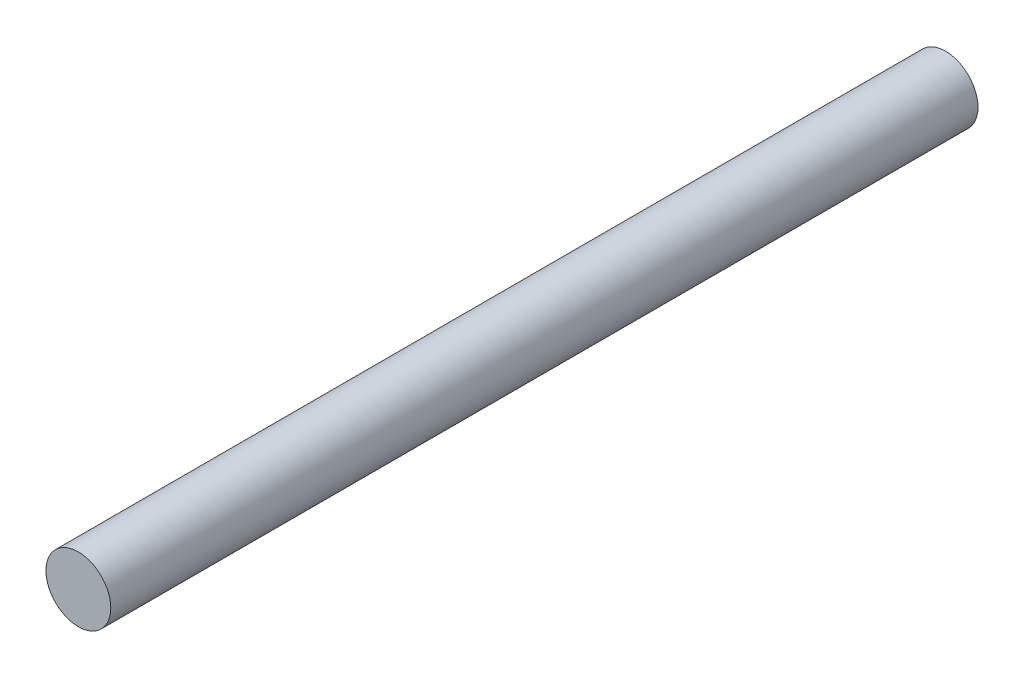
ISO-10303-21;
HEADER;
FILE_DESCRIPTION(('STEP AP214'),'2;1');
FILE_NAME('part.step','',(''),(''),'','','');
FILE_SCHEMA(('AUTOMOTIVE_DESIGN { 1 0 10303 214 1 1 1 1 }'));
ENDSEC;
DATA;
#1=APPLICATION_CONTEXT('core data for automotive mechanical design processes');
#2=APPLICATION_PROTOCOL_DEFINITION('international standard','automotive_design',2000,#1);
#3=PRODUCT_CONTEXT('',#1,'mechanical');
#4=PRODUCT('Part','Part','',(#3));
#5=PRODUCT_RELATED_PRODUCT_CATEGORY('part','',(#4));
#6=PRODUCT_DEFINITION_FORMATION('','',#4);
#7=PRODUCT_DEFINITION_CONTEXT('part definition',#1,'design');
#8=PRODUCT_DEFINITION('design','',#6,#7);
#9=PRODUCT_DEFINITION_SHAPE('','',#8);
#10=(LENGTH_UNIT() NAMED_UNIT(*) SI_UNIT(.MILLI.,.METRE.));
#11=(NAMED_UNIT(*) PLANE_ANGLE_UNIT() SI_UNIT($,.RADIAN.));
#12=(NAMED_UNIT(*) SI_UNIT($,.STERADIAN.) SOLID_ANGLE_UNIT());
#13=UNCERTAINTY_MEASURE_WITH_UNIT(LENGTH_MEASURE(1.E-05),#10,'distance_accuracy_value','');
#14=(GEOMETRIC_REPRESENTATION_CONTEXT(3) GLOBAL_UNCERTAINTY_ASSIGNED_CONTEXT((#13)) GLOBAL_UNIT_ASSIGNED_CONTEXT((#10,
#11,#12)) REPRESENTATION_CONTEXT('',''));
#15=CARTESIAN_POINT('',(0.,0.,0.));
#16=DIRECTION('',(0.,0.,1.));
#17=DIRECTION('',(1.,0.,0.));
#18=AXIS2_PLACEMENT_3D('',#15,#16,#17);
#19=CARTESIAN_POINT('',(0.,0.,80.26));
#20=DIRECTION('',(0.,0.,-1.));
#21=DIRECTION('',(-1.,0.,0.));
#22=AXIS2_PLACEMENT_3D('',#19,#20,#21);
#23=CYLINDRICAL_SURFACE('',#22,3.);
#24=CARTESIAN_POINT('',(0.,0.,80.26));
#25=DIRECTION('',(0.,0.,1.));
#26=DIRECTION('',(1.,0.,0.));
#27=AXIS2_PLACEMENT_3D('',#24,#25,#26);
#28=CIRCLE('',#27,3.);
#29=CARTESIAN_POINT('',(3.,0.,80.26));
#30=VERTEX_POINT('',#29);
#31=EDGE_CURVE('E10',#30,#30,#28,.T.);
#32=ORIENTED_EDGE('',*,*,#31,.F.);
#33=EDGE_LOOP('',(#32));
#34=FACE_BOUND('',#33,.T.);
#35=CARTESIAN_POINT('',(0.,0.,0.));
#36=DIRECTION('',(0.,0.,1.));
#37=DIRECTION('',(1.,0.,0.));
#38=AXIS2_PLACEMENT_3D('',#35,#36,#37);
#39=CIRCLE('',#38,3.);
#40=CARTESIAN_POINT('',(3.,0.,0.));
#41=VERTEX_POINT('',#40);
#42=EDGE_CURVE('E48',#41,#41,#39,.T.);
#43=ORIENTED_EDGE('',*,*,#42,.T.);
#44=EDGE_LOOP('',(#43));
#45=FACE_BOUND('',#44,.T.);
#46=ADVANCED_FACE('F45',(#34,#45),#23,.T.);
#47=CARTESIAN_POINT('',(0.,0.,80.26));
#48=DIRECTION('',(0.,0.,1.));
#49=DIRECTION('',(1.,0.,0.));
#50=AXIS2_PLACEMENT_3D('',#47,#48,#49);
#51=PLANE('',#50);
#52=ORIENTED_EDGE('',*,*,#31,.T.);
#53=EDGE_LOOP('',(#52));
#54=FACE_BOUND('',#53,.T.);
#55=ADVANCED_FACE('F62',(#54),#51,.T.);
#56=CARTESIAN_POINT('',(0.,0.,0.));
#57=DIRECTION('',(0.,0.,1.));
#58=DIRECTION('',(1.,0.,0.));
#59=AXIS2_PLACEMENT_3D('',#56,#57,#58);
#60=PLANE('',#59);
#61=ORIENTED_EDGE('',*,*,#42,.F.);
#62=EDGE_LOOP('',(#61));
#63=FACE_BOUND('',#62,.T.);
#64=ADVANCED_FACE('F60',(#63),#60,.F.);
#65=CLOSED_SHELL('',(#46,#55,#64));
#66=MANIFOLD_SOLID_BREP('B2',#65);
#67=ADVANCED_BREP_SHAPE_REPRESENTATION('',(#18,#66),#14);
#68=SHAPE_DEFINITION_REPRESENTATION(#9,#67);
ENDSEC;
END-ISO-10303-21;
